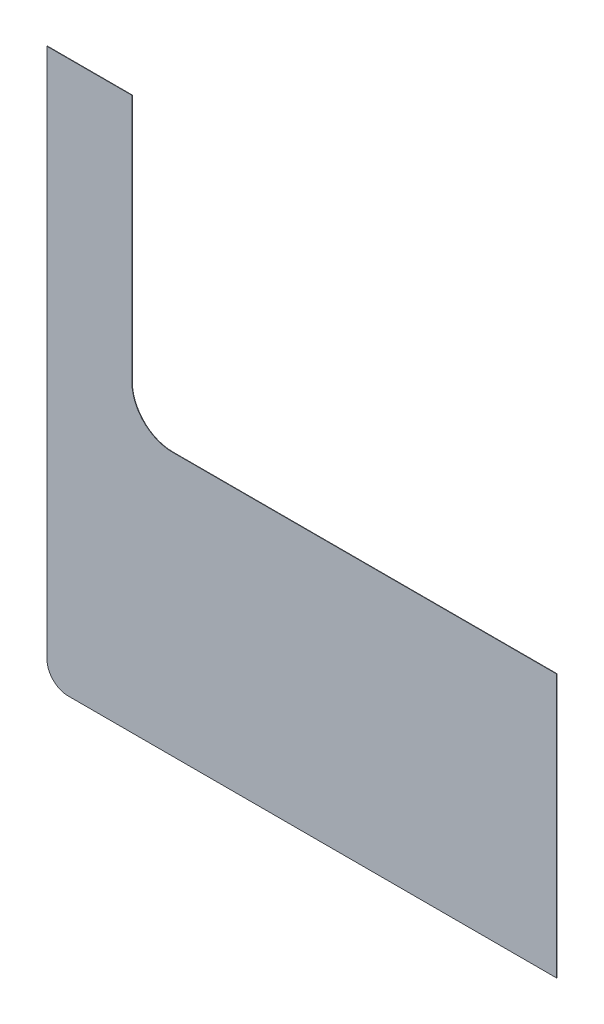
ISO-10303-21;
HEADER;
FILE_DESCRIPTION(('STEP AP214'),'2;1');
FILE_NAME('part.step','',(''),(''),'','','');
FILE_SCHEMA(('AUTOMOTIVE_DESIGN { 1 0 10303 214 1 1 1 1 }'));
ENDSEC;
DATA;
#1=APPLICATION_CONTEXT('core data for automotive mechanical design processes');
#2=APPLICATION_PROTOCOL_DEFINITION('international standard','automotive_design',2000,#1);
#3=PRODUCT_CONTEXT('',#1,'mechanical');
#4=PRODUCT('Part','Part','',(#3));
#5=PRODUCT_RELATED_PRODUCT_CATEGORY('part','',(#4));
#6=PRODUCT_DEFINITION_FORMATION('','',#4);
#7=PRODUCT_DEFINITION_CONTEXT('part definition',#1,'design');
#8=PRODUCT_DEFINITION('design','',#6,#7);
#9=PRODUCT_DEFINITION_SHAPE('','',#8);
#10=(LENGTH_UNIT() NAMED_UNIT(*) SI_UNIT(.MILLI.,.METRE.));
#11=(NAMED_UNIT(*) PLANE_ANGLE_UNIT() SI_UNIT($,.RADIAN.));
#12=(NAMED_UNIT(*) SI_UNIT($,.STERADIAN.) SOLID_ANGLE_UNIT());
#13=UNCERTAINTY_MEASURE_WITH_UNIT(LENGTH_MEASURE(1.E-05),#10,'distance_accuracy_value','');
#14=(GEOMETRIC_REPRESENTATION_CONTEXT(3) GLOBAL_UNCERTAINTY_ASSIGNED_CONTEXT((#13)) GLOBAL_UNIT_ASSIGNED_CONTEXT((#10,
#11,#12)) REPRESENTATION_CONTEXT('',''));
#15=CARTESIAN_POINT('',(0.,0.,0.));
#16=DIRECTION('',(0.,0.,1.));
#17=DIRECTION('',(1.,0.,0.));
#18=AXIS2_PLACEMENT_3D('',#15,#16,#17);
#19=CARTESIAN_POINT('',(0.,62.,0.1));
#20=DIRECTION('',(-1.,0.,0.));
#21=DIRECTION('',(0.,-1.,0.));
#22=AXIS2_PLACEMENT_3D('',#19,#20,#21);
#23=PLANE('',#22);
#24=DIRECTION('',(0.,1.,0.));
#25=VECTOR('',#24,1.);
#26=CARTESIAN_POINT('',(0.,62.,0.));
#27=LINE('',#26,#25);
#28=CARTESIAN_POINT('',(0.,0.,0.));
#29=VERTEX_POINT('',#28);
#30=CARTESIAN_POINT('',(0.,62.,0.));
#31=VERTEX_POINT('',#30);
#32=EDGE_CURVE('E124',#29,#31,#27,.T.);
#33=ORIENTED_EDGE('',*,*,#32,.T.);
#34=DIRECTION('',(0.,0.,-1.));
#35=VECTOR('',#34,1.);
#36=CARTESIAN_POINT('',(0.,62.,0.1));
#37=LINE('',#36,#35);
#38=CARTESIAN_POINT('',(0.,62.,0.1));
#39=VERTEX_POINT('',#38);
#40=EDGE_CURVE('E105',#39,#31,#37,.T.);
#41=ORIENTED_EDGE('',*,*,#40,.F.);
#42=DIRECTION('',(0.,1.,0.));
#43=VECTOR('',#42,1.);
#44=CARTESIAN_POINT('',(0.,62.,0.1));
#45=LINE('',#44,#43);
#46=CARTESIAN_POINT('',(0.,0.,0.1));
#47=VERTEX_POINT('',#46);
#48=EDGE_CURVE('E112',#47,#39,#45,.T.);
#49=ORIENTED_EDGE('',*,*,#48,.F.);
#50=DIRECTION('',(0.,0.,-1.));
#51=VECTOR('',#50,1.);
#52=CARTESIAN_POINT('',(0.,0.,0.1));
#53=LINE('',#52,#51);
#54=EDGE_CURVE('E155',#47,#29,#53,.T.);
#55=ORIENTED_EDGE('',*,*,#54,.T.);
#56=EDGE_LOOP('',(#33,#41,#49,#55));
#57=FACE_BOUND('',#56,.T.);
#58=ADVANCED_FACE('F35',(#57),#23,.F.);
#59=CARTESIAN_POINT('',(-100.,62.,0.1));
#60=DIRECTION('',(0.,-1.,0.));
#61=DIRECTION('',(0.,0.,-1.));
#62=AXIS2_PLACEMENT_3D('',#59,#60,#61);
#63=PLANE('',#62);
#64=DIRECTION('',(-1.,0.,0.));
#65=VECTOR('',#64,1.);
#66=CARTESIAN_POINT('',(-100.,62.,0.));
#67=LINE('',#66,#65);
#68=CARTESIAN_POINT('',(-90.5,62.,0.));
#69=VERTEX_POINT('',#68);
#70=EDGE_CURVE('E165',#31,#69,#67,.T.);
#71=ORIENTED_EDGE('',*,*,#70,.T.);
#72=DIRECTION('',(0.,0.,-1.));
#73=VECTOR('',#72,1.);
#74=CARTESIAN_POINT('',(-90.5,62.,0.1));
#75=LINE('',#74,#73);
#76=CARTESIAN_POINT('',(-90.5,62.,0.1));
#77=VERTEX_POINT('',#76);
#78=EDGE_CURVE('E108',#69,#77,#75,.F.);
#79=ORIENTED_EDGE('',*,*,#78,.T.);
#80=DIRECTION('',(-1.,0.,0.));
#81=VECTOR('',#80,1.);
#82=CARTESIAN_POINT('',(-100.,62.,0.1));
#83=LINE('',#82,#81);
#84=EDGE_CURVE('E100',#39,#77,#83,.T.);
#85=ORIENTED_EDGE('',*,*,#84,.F.);
#86=ORIENTED_EDGE('',*,*,#40,.T.);
#87=EDGE_LOOP('',(#71,#79,#85,#86));
#88=FACE_BOUND('',#87,.T.);
#89=ADVANCED_FACE('F103',(#88),#63,.F.);
#90=CARTESIAN_POINT('',(-100.,130.,0.1));
#91=DIRECTION('',(-1.,0.,0.));
#92=DIRECTION('',(0.,0.,1.));
#93=AXIS2_PLACEMENT_3D('',#90,#91,#92);
#94=PLANE('',#93);
#95=DIRECTION('',(0.,1.,0.));
#96=VECTOR('',#95,1.);
#97=CARTESIAN_POINT('',(-100.,130.,0.1));
#98=LINE('',#97,#96);
#99=CARTESIAN_POINT('',(-100.,71.5,0.1));
#100=VERTEX_POINT('',#99);
#101=CARTESIAN_POINT('',(-100.,130.,0.1));
#102=VERTEX_POINT('',#101);
#103=EDGE_CURVE('E111',#100,#102,#98,.T.);
#104=ORIENTED_EDGE('',*,*,#103,.F.);
#105=DIRECTION('',(0.,0.,-1.));
#106=VECTOR('',#105,1.);
#107=CARTESIAN_POINT('',(-100.,71.5,0.));
#108=LINE('',#107,#106);
#109=CARTESIAN_POINT('',(-100.,71.5,0.));
#110=VERTEX_POINT('',#109);
#111=EDGE_CURVE('E125',#100,#110,#108,.T.);
#112=ORIENTED_EDGE('',*,*,#111,.T.);
#113=DIRECTION('',(0.,1.,0.));
#114=VECTOR('',#113,1.);
#115=CARTESIAN_POINT('',(-100.,130.,0.));
#116=LINE('',#115,#114);
#117=CARTESIAN_POINT('',(-100.,130.,0.));
#118=VERTEX_POINT('',#117);
#119=EDGE_CURVE('E164',#110,#118,#116,.T.);
#120=ORIENTED_EDGE('',*,*,#119,.T.);
#121=DIRECTION('',(0.,0.,-1.));
#122=VECTOR('',#121,1.);
#123=CARTESIAN_POINT('',(-100.,130.,0.1));
#124=LINE('',#123,#122);
#125=EDGE_CURVE('E126',#102,#118,#124,.T.);
#126=ORIENTED_EDGE('',*,*,#125,.F.);
#127=EDGE_LOOP('',(#104,#112,#120,#126));
#128=FACE_BOUND('',#127,.T.);
#129=ADVANCED_FACE('F178',(#128),#94,.F.);
#130=CARTESIAN_POINT('',(-120.,130.,0.1));
#131=DIRECTION('',(0.,-1.,0.));
#132=DIRECTION('',(0.,0.,-1.));
#133=AXIS2_PLACEMENT_3D('',#130,#131,#132);
#134=PLANE('',#133);
#135=DIRECTION('',(-1.,0.,0.));
#136=VECTOR('',#135,1.);
#137=CARTESIAN_POINT('',(-120.,130.,0.));
#138=LINE('',#137,#136);
#139=CARTESIAN_POINT('',(-120.,130.,0.));
#140=VERTEX_POINT('',#139);
#141=EDGE_CURVE('E151',#118,#140,#138,.T.);
#142=ORIENTED_EDGE('',*,*,#141,.T.);
#143=DIRECTION('',(0.,0.,-1.));
#144=VECTOR('',#143,1.);
#145=CARTESIAN_POINT('',(-120.,130.,0.1));
#146=LINE('',#145,#144);
#147=CARTESIAN_POINT('',(-120.,130.,0.1));
#148=VERTEX_POINT('',#147);
#149=EDGE_CURVE('E131',#148,#140,#146,.T.);
#150=ORIENTED_EDGE('',*,*,#149,.F.);
#151=DIRECTION('',(-1.,0.,0.));
#152=VECTOR('',#151,1.);
#153=CARTESIAN_POINT('',(-120.,130.,0.1));
#154=LINE('',#153,#152);
#155=EDGE_CURVE('E172',#102,#148,#154,.T.);
#156=ORIENTED_EDGE('',*,*,#155,.F.);
#157=ORIENTED_EDGE('',*,*,#125,.T.);
#158=EDGE_LOOP('',(#142,#150,#156,#157));
#159=FACE_BOUND('',#158,.T.);
#160=ADVANCED_FACE('F179',(#159),#134,.F.);
#161=CARTESIAN_POINT('',(-120.,0.,0.1));
#162=DIRECTION('',(1.,0.,0.));
#163=DIRECTION('',(0.,0.,-1.));
#164=AXIS2_PLACEMENT_3D('',#161,#162,#163);
#165=PLANE('',#164);
#166=DIRECTION('',(0.,-1.,0.));
#167=VECTOR('',#166,1.);
#168=CARTESIAN_POINT('',(-120.,0.,0.));
#169=LINE('',#168,#167);
#170=CARTESIAN_POINT('',(-120.,4.99999999999999,0.));
#171=VERTEX_POINT('',#170);
#172=EDGE_CURVE('E149',#140,#171,#169,.T.);
#173=ORIENTED_EDGE('',*,*,#172,.T.);
#174=DIRECTION('',(0.,0.,-1.));
#175=VECTOR('',#174,1.);
#176=CARTESIAN_POINT('',(-120.,4.99999999999999,0.1));
#177=LINE('',#176,#175);
#178=CARTESIAN_POINT('',(-120.,4.99999999999999,0.1));
#179=VERTEX_POINT('',#178);
#180=EDGE_CURVE('E43',#171,#179,#177,.F.);
#181=ORIENTED_EDGE('',*,*,#180,.T.);
#182=DIRECTION('',(0.,-1.,0.));
#183=VECTOR('',#182,1.);
#184=CARTESIAN_POINT('',(-120.,0.,0.1));
#185=LINE('',#184,#183);
#186=EDGE_CURVE('E159',#148,#179,#185,.T.);
#187=ORIENTED_EDGE('',*,*,#186,.F.);
#188=ORIENTED_EDGE('',*,*,#149,.T.);
#189=EDGE_LOOP('',(#173,#181,#187,#188));
#190=FACE_BOUND('',#189,.T.);
#191=ADVANCED_FACE('F158',(#190),#165,.F.);
#192=CARTESIAN_POINT('',(0.,0.,0.1));
#193=DIRECTION('',(0.,1.,0.));
#194=DIRECTION('',(-1.,0.,0.));
#195=AXIS2_PLACEMENT_3D('',#192,#193,#194);
#196=PLANE('',#195);
#197=DIRECTION('',(1.,0.,0.));
#198=VECTOR('',#197,1.);
#199=CARTESIAN_POINT('',(0.,0.,0.1));
#200=LINE('',#199,#198);
#201=CARTESIAN_POINT('',(-115.,0.,0.1));
#202=VERTEX_POINT('',#201);
#203=EDGE_CURVE('E117',#202,#47,#200,.T.);
#204=ORIENTED_EDGE('',*,*,#203,.F.);
#205=DIRECTION('',(0.,0.,-1.));
#206=VECTOR('',#205,1.);
#207=CARTESIAN_POINT('',(-115.,0.,0.1));
#208=LINE('',#207,#206);
#209=CARTESIAN_POINT('',(-115.,0.,0.));
#210=VERTEX_POINT('',#209);
#211=EDGE_CURVE('E140',#202,#210,#208,.T.);
#212=ORIENTED_EDGE('',*,*,#211,.T.);
#213=DIRECTION('',(1.,0.,0.));
#214=VECTOR('',#213,1.);
#215=CARTESIAN_POINT('',(0.,0.,0.));
#216=LINE('',#215,#214);
#217=EDGE_CURVE('E121',#210,#29,#216,.T.);
#218=ORIENTED_EDGE('',*,*,#217,.T.);
#219=ORIENTED_EDGE('',*,*,#54,.F.);
#220=EDGE_LOOP('',(#204,#212,#218,#219));
#221=FACE_BOUND('',#220,.T.);
#222=ADVANCED_FACE('F145',(#221),#196,.F.);
#223=CARTESIAN_POINT('',(0.,0.,0.1));
#224=DIRECTION('',(0.,0.,-1.));
#225=DIRECTION('',(-1.,0.,0.));
#226=AXIS2_PLACEMENT_3D('',#223,#224,#225);
#227=PLANE('',#226);
#228=ORIENTED_EDGE('',*,*,#186,.T.);
#229=CARTESIAN_POINT('',(-115.,4.99999999999999,0.1));
#230=DIRECTION('',(0.,0.,-1.));
#231=DIRECTION('',(-1.,0.,0.));
#232=AXIS2_PLACEMENT_3D('',#229,#230,#231);
#233=CIRCLE('',#232,5.);
#234=EDGE_CURVE('E11',#179,#202,#233,.F.);
#235=ORIENTED_EDGE('',*,*,#234,.T.);
#236=ORIENTED_EDGE('',*,*,#203,.T.);
#237=ORIENTED_EDGE('',*,*,#48,.T.);
#238=ORIENTED_EDGE('',*,*,#84,.T.);
#239=CARTESIAN_POINT('',(-90.5,71.5,0.1));
#240=DIRECTION('',(0.,0.,-1.));
#241=DIRECTION('',(-1.,0.,0.));
#242=AXIS2_PLACEMENT_3D('',#239,#240,#241);
#243=CIRCLE('',#242,9.5);
#244=EDGE_CURVE('E138',#77,#100,#243,.T.);
#245=ORIENTED_EDGE('',*,*,#244,.T.);
#246=ORIENTED_EDGE('',*,*,#103,.T.);
#247=ORIENTED_EDGE('',*,*,#155,.T.);
#248=EDGE_LOOP('',(#228,#235,#236,#237,#238,#245,#246,#247));
#249=FACE_BOUND('',#248,.T.);
#250=ADVANCED_FACE('F115',(#249),#227,.F.);
#251=CARTESIAN_POINT('',(0.,0.,0.));
#252=DIRECTION('',(0.,0.,-1.));
#253=DIRECTION('',(-1.,0.,0.));
#254=AXIS2_PLACEMENT_3D('',#251,#252,#253);
#255=PLANE('',#254);
#256=ORIENTED_EDGE('',*,*,#217,.F.);
#257=CARTESIAN_POINT('',(-115.,4.99999999999999,0.));
#258=DIRECTION('',(0.,0.,-1.));
#259=DIRECTION('',(-1.,0.,0.));
#260=AXIS2_PLACEMENT_3D('',#257,#258,#259);
#261=CIRCLE('',#260,5.);
#262=EDGE_CURVE('E57',#210,#171,#261,.T.);
#263=ORIENTED_EDGE('',*,*,#262,.T.);
#264=ORIENTED_EDGE('',*,*,#172,.F.);
#265=ORIENTED_EDGE('',*,*,#141,.F.);
#266=ORIENTED_EDGE('',*,*,#119,.F.);
#267=CARTESIAN_POINT('',(-90.5,71.5,0.));
#268=DIRECTION('',(0.,0.,-1.));
#269=DIRECTION('',(-1.,0.,0.));
#270=AXIS2_PLACEMENT_3D('',#267,#268,#269);
#271=CIRCLE('',#270,9.5);
#272=EDGE_CURVE('E136',#110,#69,#271,.F.);
#273=ORIENTED_EDGE('',*,*,#272,.T.);
#274=ORIENTED_EDGE('',*,*,#70,.F.);
#275=ORIENTED_EDGE('',*,*,#32,.F.);
#276=EDGE_LOOP('',(#256,#263,#264,#265,#266,#273,#274,#275));
#277=FACE_BOUND('',#276,.T.);
#278=ADVANCED_FACE('F148',(#277),#255,.T.);
#279=CARTESIAN_POINT('',(-90.5,71.5,0.1));
#280=DIRECTION('',(0.,0.,1.));
#281=DIRECTION('',(1.,0.,0.));
#282=AXIS2_PLACEMENT_3D('',#279,#280,#281);
#283=CYLINDRICAL_SURFACE('',#282,9.5);
#284=ORIENTED_EDGE('',*,*,#244,.F.);
#285=ORIENTED_EDGE('',*,*,#78,.F.);
#286=ORIENTED_EDGE('',*,*,#272,.F.);
#287=ORIENTED_EDGE('',*,*,#111,.F.);
#288=EDGE_LOOP('',(#284,#285,#286,#287));
#289=FACE_BOUND('',#288,.T.);
#290=ADVANCED_FACE('F194',(#289),#283,.F.);
#291=CARTESIAN_POINT('',(-115.,4.99999999999999,0.1));
#292=DIRECTION('',(0.,0.,-1.));
#293=DIRECTION('',(-1.,0.,0.));
#294=AXIS2_PLACEMENT_3D('',#291,#292,#293);
#295=CYLINDRICAL_SURFACE('',#294,5.);
#296=ORIENTED_EDGE('',*,*,#234,.F.);
#297=ORIENTED_EDGE('',*,*,#180,.F.);
#298=ORIENTED_EDGE('',*,*,#262,.F.);
#299=ORIENTED_EDGE('',*,*,#211,.F.);
#300=EDGE_LOOP('',(#296,#297,#298,#299));
#301=FACE_BOUND('',#300,.T.);
#302=ADVANCED_FACE('F37',(#301),#295,.T.);
#303=CLOSED_SHELL('',(#58,#89,#129,#160,#191,#222,#250,#278,#290,#302));
#304=MANIFOLD_SOLID_BREP('B2',#303);
#305=ADVANCED_BREP_SHAPE_REPRESENTATION('',(#18,#304),#14);
#306=SHAPE_DEFINITION_REPRESENTATION(#9,#305);
ENDSEC;
END-ISO-10303-21;
